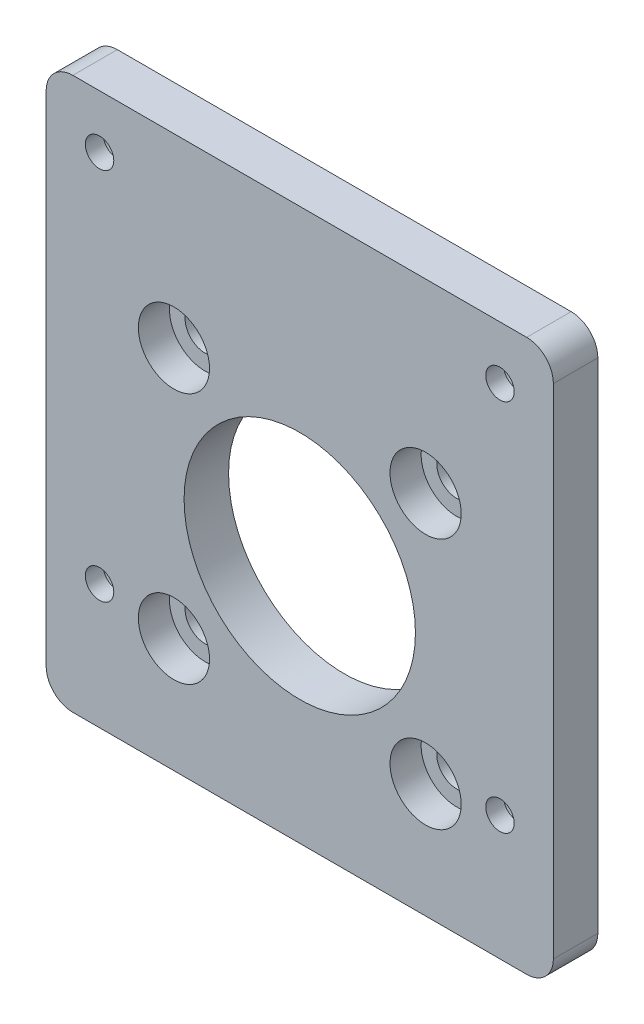
ISO-10303-21;
HEADER;
FILE_DESCRIPTION(('STEP AP214'),'2;1');
FILE_NAME('part.step','',(''),(''),'','','');
FILE_SCHEMA(('AUTOMOTIVE_DESIGN { 1 0 10303 214 1 1 1 1 }'));
ENDSEC;
DATA;
#1=APPLICATION_CONTEXT('core data for automotive mechanical design processes');
#2=APPLICATION_PROTOCOL_DEFINITION('international standard','automotive_design',2000,#1);
#3=PRODUCT_CONTEXT('',#1,'mechanical');
#4=PRODUCT('Part','Part','',(#3));
#5=PRODUCT_RELATED_PRODUCT_CATEGORY('part','',(#4));
#6=PRODUCT_DEFINITION_FORMATION('','',#4);
#7=PRODUCT_DEFINITION_CONTEXT('part definition',#1,'design');
#8=PRODUCT_DEFINITION('design','',#6,#7);
#9=PRODUCT_DEFINITION_SHAPE('','',#8);
#10=(LENGTH_UNIT() NAMED_UNIT(*) SI_UNIT(.MILLI.,.METRE.));
#11=(NAMED_UNIT(*) PLANE_ANGLE_UNIT() SI_UNIT($,.RADIAN.));
#12=(NAMED_UNIT(*) SI_UNIT($,.STERADIAN.) SOLID_ANGLE_UNIT());
#13=UNCERTAINTY_MEASURE_WITH_UNIT(LENGTH_MEASURE(1.E-05),#10,'distance_accuracy_value','');
#14=(GEOMETRIC_REPRESENTATION_CONTEXT(3) GLOBAL_UNCERTAINTY_ASSIGNED_CONTEXT((#13)) GLOBAL_UNIT_ASSIGNED_CONTEXT((#10,
#11,#12)) REPRESENTATION_CONTEXT('',''));
#15=CARTESIAN_POINT('',(0.,0.,0.));
#16=DIRECTION('',(0.,0.,1.));
#17=DIRECTION('',(1.,0.,0.));
#18=AXIS2_PLACEMENT_3D('',#15,#16,#17);
#19=CARTESIAN_POINT('',(-180.668048457713,46.6150386303977,5.));
#20=DIRECTION('',(0.,0.,-1.));
#21=DIRECTION('',(-1.,0.,0.));
#22=AXIS2_PLACEMENT_3D('',#19,#20,#21);
#23=CYLINDRICAL_SURFACE('',#22,2.25000000000001);
#24=CARTESIAN_POINT('',(-180.668048457713,46.6150386303977,0.));
#25=DIRECTION('',(0.,0.,1.));
#26=DIRECTION('',(1.,0.,0.));
#27=AXIS2_PLACEMENT_3D('',#24,#25,#26);
#28=CIRCLE('',#27,2.25000000000001);
#29=CARTESIAN_POINT('',(-178.418048457713,46.6150386303977,0.));
#30=VERTEX_POINT('',#29);
#31=EDGE_CURVE('E161',#30,#30,#28,.T.);
#32=ORIENTED_EDGE('',*,*,#31,.F.);
#33=EDGE_LOOP('',(#32));
#34=FACE_BOUND('',#33,.T.);
#35=CARTESIAN_POINT('',(-180.668048457713,46.6150386303977,1.5));
#36=DIRECTION('',(0.,0.,1.));
#37=DIRECTION('',(1.,0.,0.));
#38=AXIS2_PLACEMENT_3D('',#35,#36,#37);
#39=CIRCLE('',#38,2.25000000000001);
#40=CARTESIAN_POINT('',(-178.418048457713,46.6150386303977,1.5));
#41=VERTEX_POINT('',#40);
#42=EDGE_CURVE('E45',#41,#41,#39,.T.);
#43=ORIENTED_EDGE('',*,*,#42,.T.);
#44=EDGE_LOOP('',(#43));
#45=FACE_BOUND('',#44,.T.);
#46=ADVANCED_FACE('F41',(#34,#45),#23,.F.);
#47=CARTESIAN_POINT('',(-152.383777210251,46.6150386303972,5.));
#48=DIRECTION('',(0.,0.,-1.));
#49=DIRECTION('',(-1.,0.,0.));
#50=AXIS2_PLACEMENT_3D('',#47,#48,#49);
#51=CYLINDRICAL_SURFACE('',#50,2.25000000000001);
#52=CARTESIAN_POINT('',(-152.383777210251,46.6150386303972,0.));
#53=DIRECTION('',(0.,0.,1.));
#54=DIRECTION('',(1.,0.,0.));
#55=AXIS2_PLACEMENT_3D('',#52,#53,#54);
#56=CIRCLE('',#55,2.25000000000001);
#57=CARTESIAN_POINT('',(-150.133777210251,46.6150386303972,0.));
#58=VERTEX_POINT('',#57);
#59=EDGE_CURVE('E158',#58,#58,#56,.T.);
#60=ORIENTED_EDGE('',*,*,#59,.F.);
#61=EDGE_LOOP('',(#60));
#62=FACE_BOUND('',#61,.T.);
#63=CARTESIAN_POINT('',(-152.383777210251,46.6150386303972,1.5));
#64=DIRECTION('',(0.,0.,1.));
#65=DIRECTION('',(1.,0.,0.));
#66=AXIS2_PLACEMENT_3D('',#63,#64,#65);
#67=CIRCLE('',#66,2.25000000000001);
#68=CARTESIAN_POINT('',(-150.133777210251,46.6150386303972,1.5));
#69=VERTEX_POINT('',#68);
#70=EDGE_CURVE('E206',#69,#69,#67,.T.);
#71=ORIENTED_EDGE('',*,*,#70,.T.);
#72=EDGE_LOOP('',(#71));
#73=FACE_BOUND('',#72,.T.);
#74=ADVANCED_FACE('F266',(#62,#73),#51,.F.);
#75=CARTESIAN_POINT('',(-152.383777210252,18.3307673829352,5.));
#76=DIRECTION('',(0.,0.,-1.));
#77=DIRECTION('',(-1.,0.,0.));
#78=AXIS2_PLACEMENT_3D('',#75,#76,#77);
#79=CYLINDRICAL_SURFACE('',#78,2.25000000000001);
#80=CARTESIAN_POINT('',(-152.383777210252,18.3307673829352,0.));
#81=DIRECTION('',(0.,0.,1.));
#82=DIRECTION('',(1.,0.,0.));
#83=AXIS2_PLACEMENT_3D('',#80,#81,#82);
#84=CIRCLE('',#83,2.25000000000001);
#85=CARTESIAN_POINT('',(-150.133777210252,18.3307673829352,0.));
#86=VERTEX_POINT('',#85);
#87=EDGE_CURVE('E154',#86,#86,#84,.T.);
#88=ORIENTED_EDGE('',*,*,#87,.F.);
#89=EDGE_LOOP('',(#88));
#90=FACE_BOUND('',#89,.T.);
#91=CARTESIAN_POINT('',(-152.383777210252,18.3307673829352,1.5));
#92=DIRECTION('',(0.,0.,1.));
#93=DIRECTION('',(1.,0.,0.));
#94=AXIS2_PLACEMENT_3D('',#91,#92,#93);
#95=CIRCLE('',#94,2.25000000000001);
#96=CARTESIAN_POINT('',(-150.133777210252,18.3307673829352,1.5));
#97=VERTEX_POINT('',#96);
#98=EDGE_CURVE('E203',#97,#97,#95,.T.);
#99=ORIENTED_EDGE('',*,*,#98,.T.);
#100=EDGE_LOOP('',(#99));
#101=FACE_BOUND('',#100,.T.);
#102=ADVANCED_FACE('F272',(#90,#101),#79,.F.);
#103=CARTESIAN_POINT('',(-180.668048457714,18.3307673829358,5.));
#104=DIRECTION('',(0.,0.,-1.));
#105=DIRECTION('',(-1.,0.,0.));
#106=AXIS2_PLACEMENT_3D('',#103,#104,#105);
#107=CYLINDRICAL_SURFACE('',#106,2.25000000000001);
#108=CARTESIAN_POINT('',(-180.668048457714,18.3307673829358,0.));
#109=DIRECTION('',(0.,0.,1.));
#110=DIRECTION('',(1.,0.,0.));
#111=AXIS2_PLACEMENT_3D('',#108,#109,#110);
#112=CIRCLE('',#111,2.25000000000001);
#113=CARTESIAN_POINT('',(-178.418048457714,18.3307673829358,0.));
#114=VERTEX_POINT('',#113);
#115=EDGE_CURVE('E151',#114,#114,#112,.T.);
#116=ORIENTED_EDGE('',*,*,#115,.F.);
#117=EDGE_LOOP('',(#116));
#118=FACE_BOUND('',#117,.T.);
#119=CARTESIAN_POINT('',(-180.668048457714,18.3307673829358,1.5));
#120=DIRECTION('',(0.,0.,1.));
#121=DIRECTION('',(1.,0.,0.));
#122=AXIS2_PLACEMENT_3D('',#119,#120,#121);
#123=CIRCLE('',#122,2.25000000000001);
#124=CARTESIAN_POINT('',(-178.418048457714,18.3307673829358,1.5));
#125=VERTEX_POINT('',#124);
#126=EDGE_CURVE('E200',#125,#125,#123,.T.);
#127=ORIENTED_EDGE('',*,*,#126,.T.);
#128=EDGE_LOOP('',(#127));
#129=FACE_BOUND('',#128,.T.);
#130=ADVANCED_FACE('F43',(#118,#129),#107,.F.);
#131=CARTESIAN_POINT('',(0.,67.4729030066661,5.));
#132=DIRECTION('',(0.,1.,0.));
#133=DIRECTION('',(-1.,0.,0.));
#134=AXIS2_PLACEMENT_3D('',#131,#132,#133);
#135=PLANE('',#134);
#136=DIRECTION('',(1.,0.,0.));
#137=VECTOR('',#136,1.);
#138=CARTESIAN_POINT('',(0.,67.4729030066661,0.));
#139=LINE('',#138,#137);
#140=CARTESIAN_POINT('',(-192.025912833983,67.4729030066662,0.));
#141=VERTEX_POINT('',#140);
#142=CARTESIAN_POINT('',(-141.025912833983,67.4729030066661,0.));
#143=VERTEX_POINT('',#142);
#144=EDGE_CURVE('E167',#141,#143,#139,.T.);
#145=ORIENTED_EDGE('',*,*,#144,.F.);
#146=DIRECTION('',(0.,0.,-1.));
#147=VECTOR('',#146,1.);
#148=CARTESIAN_POINT('',(-192.025912833983,67.4729030066662,5.));
#149=LINE('',#148,#147);
#150=CARTESIAN_POINT('',(-192.025912833983,67.4729030066662,5.));
#151=VERTEX_POINT('',#150);
#152=EDGE_CURVE('E12',#151,#141,#149,.T.);
#153=ORIENTED_EDGE('',*,*,#152,.F.);
#154=DIRECTION('',(1.,0.,0.));
#155=VECTOR('',#154,1.);
#156=CARTESIAN_POINT('',(0.,67.4729030066661,5.));
#157=LINE('',#156,#155);
#158=CARTESIAN_POINT('',(-141.025912833983,67.4729030066661,5.));
#159=VERTEX_POINT('',#158);
#160=EDGE_CURVE('E235',#151,#159,#157,.T.);
#161=ORIENTED_EDGE('',*,*,#160,.T.);
#162=DIRECTION('',(0.,0.,-1.));
#163=VECTOR('',#162,1.);
#164=CARTESIAN_POINT('',(-141.025912833983,67.4729030066661,5.));
#165=LINE('',#164,#163);
#166=EDGE_CURVE('E94',#159,#143,#165,.T.);
#167=ORIENTED_EDGE('',*,*,#166,.T.);
#168=EDGE_LOOP('',(#145,#153,#161,#167));
#169=FACE_BOUND('',#168,.T.);
#170=ADVANCED_FACE('F284',(#169),#135,.T.);
#171=CARTESIAN_POINT('',(-192.025912833983,64.4729030066662,5.));
#172=DIRECTION('',(0.,0.,-1.));
#173=DIRECTION('',(-1.,0.,0.));
#174=AXIS2_PLACEMENT_3D('',#171,#172,#173);
#175=CYLINDRICAL_SURFACE('',#174,3.);
#176=CARTESIAN_POINT('',(-192.025912833983,64.4729030066662,0.));
#177=DIRECTION('',(0.,0.,1.));
#178=DIRECTION('',(1.,0.,0.));
#179=AXIS2_PLACEMENT_3D('',#176,#177,#178);
#180=CIRCLE('',#179,3.);
#181=CARTESIAN_POINT('',(-195.025912833983,64.4729030066661,0.));
#182=VERTEX_POINT('',#181);
#183=EDGE_CURVE('E170',#141,#182,#180,.T.);
#184=ORIENTED_EDGE('',*,*,#183,.T.);
#185=DIRECTION('',(0.,0.,-1.));
#186=VECTOR('',#185,1.);
#187=CARTESIAN_POINT('',(-195.025912833983,64.4729030066661,5.));
#188=LINE('',#187,#186);
#189=CARTESIAN_POINT('',(-195.025912833983,64.4729030066661,5.));
#190=VERTEX_POINT('',#189);
#191=EDGE_CURVE('E51',#190,#182,#188,.T.);
#192=ORIENTED_EDGE('',*,*,#191,.F.);
#193=CARTESIAN_POINT('',(-192.025912833983,64.4729030066662,5.));
#194=DIRECTION('',(0.,0.,1.));
#195=DIRECTION('',(1.,0.,0.));
#196=AXIS2_PLACEMENT_3D('',#193,#194,#195);
#197=CIRCLE('',#196,3.);
#198=EDGE_CURVE('E237',#151,#190,#197,.T.);
#199=ORIENTED_EDGE('',*,*,#198,.F.);
#200=ORIENTED_EDGE('',*,*,#152,.T.);
#201=EDGE_LOOP('',(#184,#192,#199,#200));
#202=FACE_BOUND('',#201,.T.);
#203=ADVANCED_FACE('F655',(#202),#175,.T.);
#204=CARTESIAN_POINT('',(-195.025912833983,0.,5.));
#205=DIRECTION('',(1.,0.,0.));
#206=DIRECTION('',(0.,0.,-1.));
#207=AXIS2_PLACEMENT_3D('',#204,#205,#206);
#208=PLANE('',#207);
#209=DIRECTION('',(0.,-1.,0.));
#210=VECTOR('',#209,1.);
#211=CARTESIAN_POINT('',(-195.025912833983,0.,0.));
#212=LINE('',#211,#210);
#213=CARTESIAN_POINT('',(-195.025912833983,8.47290300666616,0.));
#214=VERTEX_POINT('',#213);
#215=EDGE_CURVE('E173',#182,#214,#212,.T.);
#216=ORIENTED_EDGE('',*,*,#215,.T.);
#217=DIRECTION('',(0.,0.,-1.));
#218=VECTOR('',#217,1.);
#219=CARTESIAN_POINT('',(-195.025912833983,8.47290300666616,5.));
#220=LINE('',#219,#218);
#221=CARTESIAN_POINT('',(-195.025912833983,8.47290300666616,5.));
#222=VERTEX_POINT('',#221);
#223=EDGE_CURVE('E193',#222,#214,#220,.T.);
#224=ORIENTED_EDGE('',*,*,#223,.F.);
#225=DIRECTION('',(0.,-1.,0.));
#226=VECTOR('',#225,1.);
#227=CARTESIAN_POINT('',(-195.025912833983,0.,5.));
#228=LINE('',#227,#226);
#229=EDGE_CURVE('E240',#190,#222,#228,.T.);
#230=ORIENTED_EDGE('',*,*,#229,.F.);
#231=ORIENTED_EDGE('',*,*,#191,.T.);
#232=EDGE_LOOP('',(#216,#224,#230,#231));
#233=FACE_BOUND('',#232,.T.);
#234=ADVANCED_FACE('F250',(#233),#208,.F.);
#235=CARTESIAN_POINT('',(-192.025912833983,8.47290300666614,5.));
#236=DIRECTION('',(0.,0.,-1.));
#237=DIRECTION('',(-1.,0.,0.));
#238=AXIS2_PLACEMENT_3D('',#235,#236,#237);
#239=CYLINDRICAL_SURFACE('',#238,3.);
#240=CARTESIAN_POINT('',(-192.025912833983,8.47290300666614,0.));
#241=DIRECTION('',(0.,0.,1.));
#242=DIRECTION('',(1.,0.,0.));
#243=AXIS2_PLACEMENT_3D('',#240,#241,#242);
#244=CIRCLE('',#243,3.);
#245=CARTESIAN_POINT('',(-192.025912833983,5.47290300666614,0.));
#246=VERTEX_POINT('',#245);
#247=EDGE_CURVE('E176',#246,#214,#244,.F.);
#248=ORIENTED_EDGE('',*,*,#247,.F.);
#249=DIRECTION('',(0.,0.,-1.));
#250=VECTOR('',#249,1.);
#251=CARTESIAN_POINT('',(-192.025912833983,5.47290300666614,5.));
#252=LINE('',#251,#250);
#253=CARTESIAN_POINT('',(-192.025912833983,5.47290300666614,5.));
#254=VERTEX_POINT('',#253);
#255=EDGE_CURVE('E191',#254,#246,#252,.T.);
#256=ORIENTED_EDGE('',*,*,#255,.F.);
#257=CARTESIAN_POINT('',(-192.025912833983,8.47290300666614,5.));
#258=DIRECTION('',(0.,0.,1.));
#259=DIRECTION('',(1.,0.,0.));
#260=AXIS2_PLACEMENT_3D('',#257,#258,#259);
#261=CIRCLE('',#260,3.);
#262=EDGE_CURVE('E242',#254,#222,#261,.F.);
#263=ORIENTED_EDGE('',*,*,#262,.T.);
#264=ORIENTED_EDGE('',*,*,#223,.T.);
#265=EDGE_LOOP('',(#248,#256,#263,#264));
#266=FACE_BOUND('',#265,.T.);
#267=ADVANCED_FACE('F246',(#266),#239,.T.);
#268=CARTESIAN_POINT('',(0.,5.47290300666614,5.));
#269=DIRECTION('',(0.,1.,0.));
#270=DIRECTION('',(-1.,0.,0.));
#271=AXIS2_PLACEMENT_3D('',#268,#269,#270);
#272=PLANE('',#271);
#273=DIRECTION('',(1.,0.,0.));
#274=VECTOR('',#273,1.);
#275=CARTESIAN_POINT('',(0.,5.47290300666614,0.));
#276=LINE('',#275,#274);
#277=CARTESIAN_POINT('',(-141.025912833983,5.47290300666614,0.));
#278=VERTEX_POINT('',#277);
#279=EDGE_CURVE('E179',#246,#278,#276,.T.);
#280=ORIENTED_EDGE('',*,*,#279,.T.);
#281=DIRECTION('',(0.,0.,-1.));
#282=VECTOR('',#281,1.);
#283=CARTESIAN_POINT('',(-141.025912833983,5.47290300666614,5.));
#284=LINE('',#283,#282);
#285=CARTESIAN_POINT('',(-141.025912833983,5.47290300666614,5.));
#286=VERTEX_POINT('',#285);
#287=EDGE_CURVE('E132',#286,#278,#284,.T.);
#288=ORIENTED_EDGE('',*,*,#287,.F.);
#289=DIRECTION('',(1.,0.,0.));
#290=VECTOR('',#289,1.);
#291=CARTESIAN_POINT('',(0.,5.47290300666614,5.));
#292=LINE('',#291,#290);
#293=EDGE_CURVE('E120',#254,#286,#292,.T.);
#294=ORIENTED_EDGE('',*,*,#293,.F.);
#295=ORIENTED_EDGE('',*,*,#255,.T.);
#296=EDGE_LOOP('',(#280,#288,#294,#295));
#297=FACE_BOUND('',#296,.T.);
#298=ADVANCED_FACE('F256',(#297),#272,.F.);
#299=CARTESIAN_POINT('',(-141.025912833983,8.47290300666614,5.));
#300=DIRECTION('',(0.,0.,-1.));
#301=DIRECTION('',(-1.,0.,0.));
#302=AXIS2_PLACEMENT_3D('',#299,#300,#301);
#303=CYLINDRICAL_SURFACE('',#302,3.);
#304=CARTESIAN_POINT('',(-141.025912833983,8.47290300666614,0.));
#305=DIRECTION('',(0.,0.,1.));
#306=DIRECTION('',(1.,0.,0.));
#307=AXIS2_PLACEMENT_3D('',#304,#305,#306);
#308=CIRCLE('',#307,3.);
#309=CARTESIAN_POINT('',(-138.025912833983,8.47290300666616,0.));
#310=VERTEX_POINT('',#309);
#311=EDGE_CURVE('E128',#278,#310,#308,.T.);
#312=ORIENTED_EDGE('',*,*,#311,.T.);
#313=DIRECTION('',(0.,0.,-1.));
#314=VECTOR('',#313,1.);
#315=CARTESIAN_POINT('',(-138.025912833983,8.47290300666616,5.));
#316=LINE('',#315,#314);
#317=CARTESIAN_POINT('',(-138.025912833983,8.47290300666616,5.));
#318=VERTEX_POINT('',#317);
#319=EDGE_CURVE('E126',#318,#310,#316,.T.);
#320=ORIENTED_EDGE('',*,*,#319,.F.);
#321=CARTESIAN_POINT('',(-141.025912833983,8.47290300666614,5.));
#322=DIRECTION('',(0.,0.,1.));
#323=DIRECTION('',(1.,0.,0.));
#324=AXIS2_PLACEMENT_3D('',#321,#322,#323);
#325=CIRCLE('',#324,3.);
#326=EDGE_CURVE('E112',#286,#318,#325,.T.);
#327=ORIENTED_EDGE('',*,*,#326,.F.);
#328=ORIENTED_EDGE('',*,*,#287,.T.);
#329=EDGE_LOOP('',(#312,#320,#327,#328));
#330=FACE_BOUND('',#329,.T.);
#331=ADVANCED_FACE('F127',(#330),#303,.T.);
#332=CARTESIAN_POINT('',(-138.025912833983,0.,5.));
#333=DIRECTION('',(1.,0.,0.));
#334=DIRECTION('',(0.,0.,-1.));
#335=AXIS2_PLACEMENT_3D('',#332,#333,#334);
#336=PLANE('',#335);
#337=DIRECTION('',(0.,-1.,0.));
#338=VECTOR('',#337,1.);
#339=CARTESIAN_POINT('',(-138.025912833983,0.,0.));
#340=LINE('',#339,#338);
#341=CARTESIAN_POINT('',(-138.025912833983,64.4729030066661,0.));
#342=VERTEX_POINT('',#341);
#343=EDGE_CURVE('E183',#342,#310,#340,.T.);
#344=ORIENTED_EDGE('',*,*,#343,.F.);
#345=DIRECTION('',(0.,0.,-1.));
#346=VECTOR('',#345,1.);
#347=CARTESIAN_POINT('',(-138.025912833983,64.4729030066661,5.));
#348=LINE('',#347,#346);
#349=CARTESIAN_POINT('',(-138.025912833983,64.4729030066661,5.));
#350=VERTEX_POINT('',#349);
#351=EDGE_CURVE('E87',#350,#342,#348,.T.);
#352=ORIENTED_EDGE('',*,*,#351,.F.);
#353=DIRECTION('',(0.,-1.,0.));
#354=VECTOR('',#353,1.);
#355=CARTESIAN_POINT('',(-138.025912833983,0.,5.));
#356=LINE('',#355,#354);
#357=EDGE_CURVE('E117',#350,#318,#356,.T.);
#358=ORIENTED_EDGE('',*,*,#357,.T.);
#359=ORIENTED_EDGE('',*,*,#319,.T.);
#360=EDGE_LOOP('',(#344,#352,#358,#359));
#361=FACE_BOUND('',#360,.T.);
#362=ADVANCED_FACE('F134',(#361),#336,.T.);
#363=CARTESIAN_POINT('',(-144.025912833983,61.4729030066658,5.));
#364=DIRECTION('',(0.,0.,-1.));
#365=DIRECTION('',(-1.,0.,0.));
#366=AXIS2_PLACEMENT_3D('',#363,#364,#365);
#367=CYLINDRICAL_SURFACE('',#366,1.59999999999999);
#368=CARTESIAN_POINT('',(-144.025912833983,61.4729030066658,3.));
#369=DIRECTION('',(0.,0.,1.));
#370=DIRECTION('',(1.,0.,0.));
#371=AXIS2_PLACEMENT_3D('',#368,#369,#370);
#372=CIRCLE('',#371,1.59999999999999);
#373=CARTESIAN_POINT('',(-142.425912833983,61.4729030066658,3.));
#374=VERTEX_POINT('',#373);
#375=EDGE_CURVE('E323',#374,#374,#372,.F.);
#376=ORIENTED_EDGE('',*,*,#375,.T.);
#377=EDGE_LOOP('',(#376));
#378=FACE_BOUND('',#377,.T.);
#379=CARTESIAN_POINT('',(-144.025912833983,61.4729030066658,5.));
#380=DIRECTION('',(0.,0.,1.));
#381=DIRECTION('',(1.,0.,0.));
#382=AXIS2_PLACEMENT_3D('',#379,#380,#381);
#383=CIRCLE('',#382,1.59999999999999);
#384=CARTESIAN_POINT('',(-142.425912833983,61.4729030066658,5.));
#385=VERTEX_POINT('',#384);
#386=EDGE_CURVE('E145',#385,#385,#383,.F.);
#387=ORIENTED_EDGE('',*,*,#386,.F.);
#388=EDGE_LOOP('',(#387));
#389=FACE_BOUND('',#388,.T.);
#390=ADVANCED_FACE('F368',(#378,#389),#367,.F.);
#391=CARTESIAN_POINT('',(-189.025912833982,19.4729030066665,5.));
#392=DIRECTION('',(0.,0.,-1.));
#393=DIRECTION('',(-1.,0.,0.));
#394=AXIS2_PLACEMENT_3D('',#391,#392,#393);
#395=CYLINDRICAL_SURFACE('',#394,1.59999999999999);
#396=CARTESIAN_POINT('',(-189.025912833982,19.4729030066665,3.));
#397=DIRECTION('',(0.,0.,1.));
#398=DIRECTION('',(1.,0.,0.));
#399=AXIS2_PLACEMENT_3D('',#396,#397,#398);
#400=CIRCLE('',#399,1.59999999999999);
#401=CARTESIAN_POINT('',(-187.425912833982,19.4729030066665,3.));
#402=VERTEX_POINT('',#401);
#403=EDGE_CURVE('E155',#402,#402,#400,.F.);
#404=ORIENTED_EDGE('',*,*,#403,.T.);
#405=EDGE_LOOP('',(#404));
#406=FACE_BOUND('',#405,.T.);
#407=CARTESIAN_POINT('',(-189.025912833982,19.4729030066665,5.));
#408=DIRECTION('',(0.,0.,1.));
#409=DIRECTION('',(1.,0.,0.));
#410=AXIS2_PLACEMENT_3D('',#407,#408,#409);
#411=CIRCLE('',#410,1.59999999999999);
#412=CARTESIAN_POINT('',(-187.425912833982,19.4729030066665,5.));
#413=VERTEX_POINT('',#412);
#414=EDGE_CURVE('E142',#413,#413,#411,.F.);
#415=ORIENTED_EDGE('',*,*,#414,.F.);
#416=EDGE_LOOP('',(#415));
#417=FACE_BOUND('',#416,.T.);
#418=ADVANCED_FACE('F344',(#406,#417),#395,.F.);
#419=CARTESIAN_POINT('',(-144.025912833983,19.4729030066665,5.));
#420=DIRECTION('',(0.,0.,-1.));
#421=DIRECTION('',(-1.,0.,0.));
#422=AXIS2_PLACEMENT_3D('',#419,#420,#421);
#423=CYLINDRICAL_SURFACE('',#422,1.59999999999999);
#424=CARTESIAN_POINT('',(-144.025912833983,19.4729030066665,3.));
#425=DIRECTION('',(0.,0.,1.));
#426=DIRECTION('',(1.,0.,0.));
#427=AXIS2_PLACEMENT_3D('',#424,#425,#426);
#428=CIRCLE('',#427,1.59999999999999);
#429=CARTESIAN_POINT('',(-142.425912833983,19.4729030066665,3.));
#430=VERTEX_POINT('',#429);
#431=EDGE_CURVE('E332',#430,#430,#428,.T.);
#432=ORIENTED_EDGE('',*,*,#431,.F.);
#433=EDGE_LOOP('',(#432));
#434=FACE_BOUND('',#433,.T.);
#435=CARTESIAN_POINT('',(-144.025912833983,19.4729030066665,5.));
#436=DIRECTION('',(0.,0.,1.));
#437=DIRECTION('',(1.,0.,0.));
#438=AXIS2_PLACEMENT_3D('',#435,#436,#437);
#439=CIRCLE('',#438,1.59999999999999);
#440=CARTESIAN_POINT('',(-142.425912833983,19.4729030066665,5.));
#441=VERTEX_POINT('',#440);
#442=EDGE_CURVE('E136',#441,#441,#439,.T.);
#443=ORIENTED_EDGE('',*,*,#442,.T.);
#444=EDGE_LOOP('',(#443));
#445=FACE_BOUND('',#444,.T.);
#446=ADVANCED_FACE('F340',(#434,#445),#423,.F.);
#447=CARTESIAN_POINT('',(-141.025912833983,64.4729030066661,5.));
#448=DIRECTION('',(0.,0.,-1.));
#449=DIRECTION('',(-1.,0.,0.));
#450=AXIS2_PLACEMENT_3D('',#447,#448,#449);
#451=CYLINDRICAL_SURFACE('',#450,3.);
#452=CARTESIAN_POINT('',(-141.025912833983,64.4729030066661,0.));
#453=DIRECTION('',(0.,0.,1.));
#454=DIRECTION('',(1.,0.,0.));
#455=AXIS2_PLACEMENT_3D('',#452,#453,#454);
#456=CIRCLE('',#455,3.);
#457=EDGE_CURVE('E185',#342,#143,#456,.T.);
#458=ORIENTED_EDGE('',*,*,#457,.T.);
#459=ORIENTED_EDGE('',*,*,#166,.F.);
#460=CARTESIAN_POINT('',(-141.025912833983,64.4729030066661,5.));
#461=DIRECTION('',(0.,0.,1.));
#462=DIRECTION('',(1.,0.,0.));
#463=AXIS2_PLACEMENT_3D('',#460,#461,#462);
#464=CIRCLE('',#463,3.);
#465=EDGE_CURVE('E60',#350,#159,#464,.T.);
#466=ORIENTED_EDGE('',*,*,#465,.F.);
#467=ORIENTED_EDGE('',*,*,#351,.T.);
#468=EDGE_LOOP('',(#458,#459,#466,#467));
#469=FACE_BOUND('',#468,.T.);
#470=ADVANCED_FACE('F343',(#469),#451,.T.);
#471=CARTESIAN_POINT('',(-166.525912833983,32.4729030066665,5.));
#472=DIRECTION('',(0.,0.,-1.));
#473=DIRECTION('',(-1.,0.,0.));
#474=AXIS2_PLACEMENT_3D('',#471,#472,#473);
#475=CYLINDRICAL_SURFACE('',#474,13.);
#476=CARTESIAN_POINT('',(-166.525912833983,32.4729030066665,5.));
#477=DIRECTION('',(0.,0.,1.));
#478=DIRECTION('',(1.,0.,0.));
#479=AXIS2_PLACEMENT_3D('',#476,#477,#478);
#480=CIRCLE('',#479,13.);
#481=CARTESIAN_POINT('',(-153.525912833983,32.4729030066665,5.));
#482=VERTEX_POINT('',#481);
#483=EDGE_CURVE('E187',#482,#482,#480,.T.);
#484=ORIENTED_EDGE('',*,*,#483,.T.);
#485=EDGE_LOOP('',(#484));
#486=FACE_BOUND('',#485,.T.);
#487=CARTESIAN_POINT('',(-166.525912833983,32.4729030066665,0.));
#488=DIRECTION('',(0.,0.,1.));
#489=DIRECTION('',(1.,0.,0.));
#490=AXIS2_PLACEMENT_3D('',#487,#488,#489);
#491=CIRCLE('',#490,13.);
#492=CARTESIAN_POINT('',(-153.525912833983,32.4729030066665,0.));
#493=VERTEX_POINT('',#492);
#494=EDGE_CURVE('E164',#493,#493,#491,.T.);
#495=ORIENTED_EDGE('',*,*,#494,.F.);
#496=EDGE_LOOP('',(#495));
#497=FACE_BOUND('',#496,.T.);
#498=ADVANCED_FACE('F277',(#486,#497),#475,.F.);
#499=CARTESIAN_POINT('',(-189.025912833982,61.4729030066658,5.));
#500=DIRECTION('',(0.,0.,-1.));
#501=DIRECTION('',(-1.,0.,0.));
#502=AXIS2_PLACEMENT_3D('',#499,#500,#501);
#503=CYLINDRICAL_SURFACE('',#502,1.59999999999999);
#504=CARTESIAN_POINT('',(-189.025912833982,61.4729030066658,3.));
#505=DIRECTION('',(0.,0.,1.));
#506=DIRECTION('',(1.,0.,0.));
#507=AXIS2_PLACEMENT_3D('',#504,#505,#506);
#508=CIRCLE('',#507,1.59999999999999);
#509=CARTESIAN_POINT('',(-187.425912833982,61.4729030066658,3.));
#510=VERTEX_POINT('',#509);
#511=EDGE_CURVE('E224',#510,#510,#508,.T.);
#512=ORIENTED_EDGE('',*,*,#511,.F.);
#513=EDGE_LOOP('',(#512));
#514=FACE_BOUND('',#513,.T.);
#515=CARTESIAN_POINT('',(-189.025912833982,61.4729030066658,5.));
#516=DIRECTION('',(0.,0.,1.));
#517=DIRECTION('',(1.,0.,0.));
#518=AXIS2_PLACEMENT_3D('',#515,#516,#517);
#519=CIRCLE('',#518,1.59999999999999);
#520=CARTESIAN_POINT('',(-187.425912833982,61.4729030066658,5.));
#521=VERTEX_POINT('',#520);
#522=EDGE_CURVE('E148',#521,#521,#519,.T.);
#523=ORIENTED_EDGE('',*,*,#522,.T.);
#524=EDGE_LOOP('',(#523));
#525=FACE_BOUND('',#524,.T.);
#526=ADVANCED_FACE('F349',(#514,#525),#503,.F.);
#527=CARTESIAN_POINT('',(0.,0.,5.));
#528=DIRECTION('',(0.,0.,1.));
#529=DIRECTION('',(1.,0.,0.));
#530=AXIS2_PLACEMENT_3D('',#527,#528,#529);
#531=PLANE('',#530);
#532=CARTESIAN_POINT('',(-180.668048457714,18.3307673829358,5.));
#533=DIRECTION('',(0.,0.,1.));
#534=DIRECTION('',(1.,0.,0.));
#535=AXIS2_PLACEMENT_3D('',#532,#533,#534);
#536=CIRCLE('',#535,3.99999999999999);
#537=CARTESIAN_POINT('',(-176.668048457714,18.3307673829358,5.));
#538=VERTEX_POINT('',#537);
#539=EDGE_CURVE('E313',#538,#538,#536,.T.);
#540=ORIENTED_EDGE('',*,*,#539,.F.);
#541=EDGE_LOOP('',(#540));
#542=FACE_BOUND('',#541,.T.);
#543=CARTESIAN_POINT('',(-152.383777210252,18.3307673829352,5.));
#544=DIRECTION('',(0.,0.,1.));
#545=DIRECTION('',(1.,0.,0.));
#546=AXIS2_PLACEMENT_3D('',#543,#544,#545);
#547=CIRCLE('',#546,3.99999999999999);
#548=CARTESIAN_POINT('',(-148.383777210252,18.3307673829352,5.));
#549=VERTEX_POINT('',#548);
#550=EDGE_CURVE('E301',#549,#549,#547,.T.);
#551=ORIENTED_EDGE('',*,*,#550,.F.);
#552=EDGE_LOOP('',(#551));
#553=FACE_BOUND('',#552,.T.);
#554=CARTESIAN_POINT('',(-152.383777210251,46.6150386303972,5.));
#555=DIRECTION('',(0.,0.,1.));
#556=DIRECTION('',(1.,0.,0.));
#557=AXIS2_PLACEMENT_3D('',#554,#555,#556);
#558=CIRCLE('',#557,3.99999999999999);
#559=CARTESIAN_POINT('',(-148.383777210251,46.6150386303972,5.));
#560=VERTEX_POINT('',#559);
#561=EDGE_CURVE('E300',#560,#560,#558,.T.);
#562=ORIENTED_EDGE('',*,*,#561,.F.);
#563=EDGE_LOOP('',(#562));
#564=FACE_BOUND('',#563,.T.);
#565=CARTESIAN_POINT('',(-180.668048457713,46.6150386303977,5.));
#566=DIRECTION('',(0.,0.,1.));
#567=DIRECTION('',(1.,0.,0.));
#568=AXIS2_PLACEMENT_3D('',#565,#566,#567);
#569=CIRCLE('',#568,3.99999999999999);
#570=CARTESIAN_POINT('',(-176.668048457713,46.6150386303977,5.));
#571=VERTEX_POINT('',#570);
#572=EDGE_CURVE('E318',#571,#571,#569,.T.);
#573=ORIENTED_EDGE('',*,*,#572,.F.);
#574=EDGE_LOOP('',(#573));
#575=FACE_BOUND('',#574,.T.);
#576=ORIENTED_EDGE('',*,*,#483,.F.);
#577=EDGE_LOOP('',(#576));
#578=FACE_BOUND('',#577,.T.);
#579=ORIENTED_EDGE('',*,*,#160,.F.);
#580=ORIENTED_EDGE('',*,*,#198,.T.);
#581=ORIENTED_EDGE('',*,*,#229,.T.);
#582=ORIENTED_EDGE('',*,*,#262,.F.);
#583=ORIENTED_EDGE('',*,*,#293,.T.);
#584=ORIENTED_EDGE('',*,*,#326,.T.);
#585=ORIENTED_EDGE('',*,*,#357,.F.);
#586=ORIENTED_EDGE('',*,*,#465,.T.);
#587=EDGE_LOOP('',(#579,#580,#581,#582,#583,#584,#585,#586));
#588=FACE_BOUND('',#587,.T.);
#589=ORIENTED_EDGE('',*,*,#442,.F.);
#590=EDGE_LOOP('',(#589));
#591=FACE_BOUND('',#590,.T.);
#592=ORIENTED_EDGE('',*,*,#414,.T.);
#593=EDGE_LOOP('',(#592));
#594=FACE_BOUND('',#593,.T.);
#595=ORIENTED_EDGE('',*,*,#386,.T.);
#596=EDGE_LOOP('',(#595));
#597=FACE_BOUND('',#596,.T.);
#598=ORIENTED_EDGE('',*,*,#522,.F.);
#599=EDGE_LOOP('',(#598));
#600=FACE_BOUND('',#599,.T.);
#601=ADVANCED_FACE('F114',(#542,#553,#564,#575,#578,#588,#591,#594,#597,#600),#531,.T.);
#602=CARTESIAN_POINT('',(0.,0.,0.));
#603=DIRECTION('',(0.,0.,1.));
#604=DIRECTION('',(1.,0.,0.));
#605=AXIS2_PLACEMENT_3D('',#602,#603,#604);
#606=PLANE('',#605);
#607=CARTESIAN_POINT('',(-189.025912833982,19.4729030066665,0.));
#608=DIRECTION('',(0.,0.,1.));
#609=DIRECTION('',(1.,0.,0.));
#610=AXIS2_PLACEMENT_3D('',#607,#608,#609);
#611=CIRCLE('',#610,2.99999999999999);
#612=CARTESIAN_POINT('',(-186.025912833982,19.4729030066665,0.));
#613=VERTEX_POINT('',#612);
#614=EDGE_CURVE('E215',#613,#613,#611,.T.);
#615=ORIENTED_EDGE('',*,*,#614,.T.);
#616=EDGE_LOOP('',(#615));
#617=FACE_BOUND('',#616,.T.);
#618=CARTESIAN_POINT('',(-144.025912833983,19.4729030066665,0.));
#619=DIRECTION('',(0.,0.,1.));
#620=DIRECTION('',(1.,0.,0.));
#621=AXIS2_PLACEMENT_3D('',#618,#619,#620);
#622=CIRCLE('',#621,2.99999999999999);
#623=CARTESIAN_POINT('',(-141.025912833983,19.4729030066665,0.));
#624=VERTEX_POINT('',#623);
#625=EDGE_CURVE('E327',#624,#624,#622,.T.);
#626=ORIENTED_EDGE('',*,*,#625,.T.);
#627=EDGE_LOOP('',(#626));
#628=FACE_BOUND('',#627,.T.);
#629=CARTESIAN_POINT('',(-144.025912833983,61.4729030066658,0.));
#630=DIRECTION('',(0.,0.,1.));
#631=DIRECTION('',(1.,0.,0.));
#632=AXIS2_PLACEMENT_3D('',#629,#630,#631);
#633=CIRCLE('',#632,3.0000000000008);
#634=CARTESIAN_POINT('',(-141.025912833982,61.4729030066658,0.));
#635=VERTEX_POINT('',#634);
#636=EDGE_CURVE('E232',#635,#635,#633,.T.);
#637=ORIENTED_EDGE('',*,*,#636,.T.);
#638=EDGE_LOOP('',(#637));
#639=FACE_BOUND('',#638,.T.);
#640=CARTESIAN_POINT('',(-189.025912833982,61.4729030066658,0.));
#641=DIRECTION('',(0.,0.,1.));
#642=DIRECTION('',(1.,0.,0.));
#643=AXIS2_PLACEMENT_3D('',#640,#641,#642);
#644=CIRCLE('',#643,3.00000000000076);
#645=CARTESIAN_POINT('',(-186.025912833981,61.4729030066658,0.));
#646=VERTEX_POINT('',#645);
#647=EDGE_CURVE('E227',#646,#646,#644,.T.);
#648=ORIENTED_EDGE('',*,*,#647,.T.);
#649=EDGE_LOOP('',(#648));
#650=FACE_BOUND('',#649,.T.);
#651=ORIENTED_EDGE('',*,*,#115,.T.);
#652=EDGE_LOOP('',(#651));
#653=FACE_BOUND('',#652,.T.);
#654=ORIENTED_EDGE('',*,*,#87,.T.);
#655=EDGE_LOOP('',(#654));
#656=FACE_BOUND('',#655,.T.);
#657=ORIENTED_EDGE('',*,*,#59,.T.);
#658=EDGE_LOOP('',(#657));
#659=FACE_BOUND('',#658,.T.);
#660=ORIENTED_EDGE('',*,*,#31,.T.);
#661=EDGE_LOOP('',(#660));
#662=FACE_BOUND('',#661,.T.);
#663=ORIENTED_EDGE('',*,*,#494,.T.);
#664=EDGE_LOOP('',(#663));
#665=FACE_BOUND('',#664,.T.);
#666=ORIENTED_EDGE('',*,*,#144,.T.);
#667=ORIENTED_EDGE('',*,*,#457,.F.);
#668=ORIENTED_EDGE('',*,*,#343,.T.);
#669=ORIENTED_EDGE('',*,*,#311,.F.);
#670=ORIENTED_EDGE('',*,*,#279,.F.);
#671=ORIENTED_EDGE('',*,*,#247,.T.);
#672=ORIENTED_EDGE('',*,*,#215,.F.);
#673=ORIENTED_EDGE('',*,*,#183,.F.);
#674=EDGE_LOOP('',(#666,#667,#668,#669,#670,#671,#672,#673));
#675=FACE_BOUND('',#674,.T.);
#676=ADVANCED_FACE('F254',(#617,#628,#639,#650,#653,#656,#659,#662,#665,#675),#606,.F.);
#677=CARTESIAN_POINT('',(-189.025912833982,61.4729030066658,3.));
#678=DIRECTION('',(0.,0.,-1.));
#679=DIRECTION('',(-1.,0.,0.));
#680=AXIS2_PLACEMENT_3D('',#677,#678,#679);
#681=CYLINDRICAL_SURFACE('',#680,3.00000000000076);
#682=CARTESIAN_POINT('',(-189.025912833982,61.4729030066658,3.));
#683=DIRECTION('',(0.,0.,1.));
#684=DIRECTION('',(1.,0.,0.));
#685=AXIS2_PLACEMENT_3D('',#682,#683,#684);
#686=CIRCLE('',#685,3.00000000000076);
#687=CARTESIAN_POINT('',(-186.025912833981,61.4729030066658,3.));
#688=VERTEX_POINT('',#687);
#689=EDGE_CURVE('E199',#688,#688,#686,.T.);
#690=ORIENTED_EDGE('',*,*,#689,.T.);
#691=EDGE_LOOP('',(#690));
#692=FACE_BOUND('',#691,.T.);
#693=ORIENTED_EDGE('',*,*,#647,.F.);
#694=EDGE_LOOP('',(#693));
#695=FACE_BOUND('',#694,.T.);
#696=ADVANCED_FACE('F437',(#692,#695),#681,.F.);
#697=CARTESIAN_POINT('',(0.,0.,3.));
#698=DIRECTION('',(0.,0.,1.));
#699=DIRECTION('',(1.,0.,0.));
#700=AXIS2_PLACEMENT_3D('',#697,#698,#699);
#701=PLANE('',#700);
#702=ORIENTED_EDGE('',*,*,#511,.T.);
#703=EDGE_LOOP('',(#702));
#704=FACE_BOUND('',#703,.T.);
#705=ORIENTED_EDGE('',*,*,#689,.F.);
#706=EDGE_LOOP('',(#705));
#707=FACE_BOUND('',#706,.T.);
#708=ADVANCED_FACE('F457',(#704,#707),#701,.F.);
#709=CARTESIAN_POINT('',(-144.025912833983,61.4729030066658,3.));
#710=DIRECTION('',(0.,0.,-1.));
#711=DIRECTION('',(-1.,0.,0.));
#712=AXIS2_PLACEMENT_3D('',#709,#710,#711);
#713=CYLINDRICAL_SURFACE('',#712,3.0000000000008);
#714=CARTESIAN_POINT('',(-144.025912833983,61.4729030066658,3.));
#715=DIRECTION('',(0.,0.,1.));
#716=DIRECTION('',(1.,0.,0.));
#717=AXIS2_PLACEMENT_3D('',#714,#715,#716);
#718=CIRCLE('',#717,3.0000000000008);
#719=CARTESIAN_POINT('',(-141.025912833982,61.4729030066658,3.));
#720=VERTEX_POINT('',#719);
#721=EDGE_CURVE('E324',#720,#720,#718,.T.);
#722=ORIENTED_EDGE('',*,*,#721,.T.);
#723=EDGE_LOOP('',(#722));
#724=FACE_BOUND('',#723,.T.);
#725=ORIENTED_EDGE('',*,*,#636,.F.);
#726=EDGE_LOOP('',(#725));
#727=FACE_BOUND('',#726,.T.);
#728=ADVANCED_FACE('F469',(#724,#727),#713,.F.);
#729=CARTESIAN_POINT('',(0.,0.,3.));
#730=DIRECTION('',(0.,0.,1.));
#731=DIRECTION('',(1.,0.,0.));
#732=AXIS2_PLACEMENT_3D('',#729,#730,#731);
#733=PLANE('',#732);
#734=ORIENTED_EDGE('',*,*,#375,.F.);
#735=EDGE_LOOP('',(#734));
#736=FACE_BOUND('',#735,.T.);
#737=ORIENTED_EDGE('',*,*,#721,.F.);
#738=EDGE_LOOP('',(#737));
#739=FACE_BOUND('',#738,.T.);
#740=ADVANCED_FACE('F478',(#736,#739),#733,.F.);
#741=CARTESIAN_POINT('',(-144.025912833983,19.4729030066665,3.));
#742=DIRECTION('',(0.,0.,-1.));
#743=DIRECTION('',(-1.,0.,0.));
#744=AXIS2_PLACEMENT_3D('',#741,#742,#743);
#745=CYLINDRICAL_SURFACE('',#744,2.99999999999999);
#746=CARTESIAN_POINT('',(-144.025912833983,19.4729030066665,3.));
#747=DIRECTION('',(0.,0.,1.));
#748=DIRECTION('',(1.,0.,0.));
#749=AXIS2_PLACEMENT_3D('',#746,#747,#748);
#750=CIRCLE('',#749,2.99999999999999);
#751=CARTESIAN_POINT('',(-141.025912833983,19.4729030066665,3.));
#752=VERTEX_POINT('',#751);
#753=EDGE_CURVE('E220',#752,#752,#750,.T.);
#754=ORIENTED_EDGE('',*,*,#753,.T.);
#755=EDGE_LOOP('',(#754));
#756=FACE_BOUND('',#755,.T.);
#757=ORIENTED_EDGE('',*,*,#625,.F.);
#758=EDGE_LOOP('',(#757));
#759=FACE_BOUND('',#758,.T.);
#760=ADVANCED_FACE('F490',(#756,#759),#745,.F.);
#761=CARTESIAN_POINT('',(0.,0.,3.));
#762=DIRECTION('',(0.,0.,1.));
#763=DIRECTION('',(1.,0.,0.));
#764=AXIS2_PLACEMENT_3D('',#761,#762,#763);
#765=PLANE('',#764);
#766=ORIENTED_EDGE('',*,*,#431,.T.);
#767=EDGE_LOOP('',(#766));
#768=FACE_BOUND('',#767,.T.);
#769=ORIENTED_EDGE('',*,*,#753,.F.);
#770=EDGE_LOOP('',(#769));
#771=FACE_BOUND('',#770,.T.);
#772=ADVANCED_FACE('F337',(#768,#771),#765,.F.);
#773=CARTESIAN_POINT('',(0.,0.,3.));
#774=DIRECTION('',(0.,0.,1.));
#775=DIRECTION('',(1.,0.,0.));
#776=AXIS2_PLACEMENT_3D('',#773,#774,#775);
#777=PLANE('',#776);
#778=CARTESIAN_POINT('',(-189.025912833982,19.4729030066665,3.));
#779=DIRECTION('',(0.,0.,1.));
#780=DIRECTION('',(1.,0.,0.));
#781=AXIS2_PLACEMENT_3D('',#778,#779,#780);
#782=CIRCLE('',#781,2.99999999999999);
#783=CARTESIAN_POINT('',(-186.025912833982,19.4729030066665,3.));
#784=VERTEX_POINT('',#783);
#785=EDGE_CURVE('E211',#784,#784,#782,.T.);
#786=ORIENTED_EDGE('',*,*,#785,.F.);
#787=EDGE_LOOP('',(#786));
#788=FACE_BOUND('',#787,.T.);
#789=ORIENTED_EDGE('',*,*,#403,.F.);
#790=EDGE_LOOP('',(#789));
#791=FACE_BOUND('',#790,.T.);
#792=ADVANCED_FACE('F507',(#788,#791),#777,.F.);
#793=CARTESIAN_POINT('',(-189.025912833982,19.4729030066665,3.));
#794=DIRECTION('',(0.,0.,-1.));
#795=DIRECTION('',(-1.,0.,0.));
#796=AXIS2_PLACEMENT_3D('',#793,#794,#795);
#797=CYLINDRICAL_SURFACE('',#796,2.99999999999999);
#798=ORIENTED_EDGE('',*,*,#785,.T.);
#799=EDGE_LOOP('',(#798));
#800=FACE_BOUND('',#799,.T.);
#801=ORIENTED_EDGE('',*,*,#614,.F.);
#802=EDGE_LOOP('',(#801));
#803=FACE_BOUND('',#802,.T.);
#804=ADVANCED_FACE('F515',(#800,#803),#797,.F.);
#805=CARTESIAN_POINT('',(-180.668048457713,46.6150386303977,1.5));
#806=DIRECTION('',(0.,0.,1.));
#807=DIRECTION('',(1.,0.,0.));
#808=AXIS2_PLACEMENT_3D('',#805,#806,#807);
#809=CYLINDRICAL_SURFACE('',#808,3.99999999999999);
#810=CARTESIAN_POINT('',(-180.668048457713,46.6150386303977,1.5));
#811=DIRECTION('',(0.,0.,1.));
#812=DIRECTION('',(1.,0.,0.));
#813=AXIS2_PLACEMENT_3D('',#810,#811,#812);
#814=CIRCLE('',#813,3.99999999999999);
#815=CARTESIAN_POINT('',(-176.668048457713,46.6150386303977,1.5));
#816=VERTEX_POINT('',#815);
#817=EDGE_CURVE('E204',#816,#816,#814,.T.);
#818=ORIENTED_EDGE('',*,*,#817,.F.);
#819=EDGE_LOOP('',(#818));
#820=FACE_BOUND('',#819,.T.);
#821=ORIENTED_EDGE('',*,*,#572,.T.);
#822=EDGE_LOOP('',(#821));
#823=FACE_BOUND('',#822,.T.);
#824=ADVANCED_FACE('F524',(#820,#823),#809,.F.);
#825=CARTESIAN_POINT('',(-180.668048457713,46.6150386303977,1.5));
#826=DIRECTION('',(0.,0.,1.));
#827=DIRECTION('',(1.,0.,0.));
#828=AXIS2_PLACEMENT_3D('',#825,#826,#827);
#829=PLANE('',#828);
#830=ORIENTED_EDGE('',*,*,#42,.F.);
#831=EDGE_LOOP('',(#830));
#832=FACE_BOUND('',#831,.T.);
#833=ORIENTED_EDGE('',*,*,#817,.T.);
#834=EDGE_LOOP('',(#833));
#835=FACE_BOUND('',#834,.T.);
#836=ADVANCED_FACE('F548',(#832,#835),#829,.T.);
#837=CARTESIAN_POINT('',(-152.383777210251,46.6150386303972,1.5));
#838=DIRECTION('',(0.,0.,1.));
#839=DIRECTION('',(1.,0.,0.));
#840=AXIS2_PLACEMENT_3D('',#837,#838,#839);
#841=CYLINDRICAL_SURFACE('',#840,3.99999999999999);
#842=CARTESIAN_POINT('',(-152.383777210251,46.6150386303972,1.5));
#843=DIRECTION('',(0.,0.,1.));
#844=DIRECTION('',(1.,0.,0.));
#845=AXIS2_PLACEMENT_3D('',#842,#843,#844);
#846=CIRCLE('',#845,3.99999999999999);
#847=CARTESIAN_POINT('',(-148.383777210251,46.6150386303972,1.5));
#848=VERTEX_POINT('',#847);
#849=EDGE_CURVE('E304',#848,#848,#846,.T.);
#850=ORIENTED_EDGE('',*,*,#849,.F.);
#851=EDGE_LOOP('',(#850));
#852=FACE_BOUND('',#851,.T.);
#853=ORIENTED_EDGE('',*,*,#561,.T.);
#854=EDGE_LOOP('',(#853));
#855=FACE_BOUND('',#854,.T.);
#856=ADVANCED_FACE('F557',(#852,#855),#841,.F.);
#857=CARTESIAN_POINT('',(-152.383777210251,46.6150386303972,1.5));
#858=DIRECTION('',(0.,0.,1.));
#859=DIRECTION('',(1.,0.,0.));
#860=AXIS2_PLACEMENT_3D('',#857,#858,#859);
#861=PLANE('',#860);
#862=ORIENTED_EDGE('',*,*,#70,.F.);
#863=EDGE_LOOP('',(#862));
#864=FACE_BOUND('',#863,.T.);
#865=ORIENTED_EDGE('',*,*,#849,.T.);
#866=EDGE_LOOP('',(#865));
#867=FACE_BOUND('',#866,.T.);
#868=ADVANCED_FACE('F566',(#864,#867),#861,.T.);
#869=CARTESIAN_POINT('',(-152.383777210252,18.3307673829352,1.5));
#870=DIRECTION('',(0.,0.,1.));
#871=DIRECTION('',(1.,0.,0.));
#872=AXIS2_PLACEMENT_3D('',#869,#870,#871);
#873=CYLINDRICAL_SURFACE('',#872,3.99999999999999);
#874=CARTESIAN_POINT('',(-152.383777210252,18.3307673829352,1.5));
#875=DIRECTION('',(0.,0.,1.));
#876=DIRECTION('',(1.,0.,0.));
#877=AXIS2_PLACEMENT_3D('',#874,#875,#876);
#878=CIRCLE('',#877,3.99999999999999);
#879=CARTESIAN_POINT('',(-148.383777210252,18.3307673829352,1.5));
#880=VERTEX_POINT('',#879);
#881=EDGE_CURVE('E298',#880,#880,#878,.T.);
#882=ORIENTED_EDGE('',*,*,#881,.F.);
#883=EDGE_LOOP('',(#882));
#884=FACE_BOUND('',#883,.T.);
#885=ORIENTED_EDGE('',*,*,#550,.T.);
#886=EDGE_LOOP('',(#885));
#887=FACE_BOUND('',#886,.T.);
#888=ADVANCED_FACE('F294',(#884,#887),#873,.F.);
#889=CARTESIAN_POINT('',(-152.383777210252,18.3307673829352,1.5));
#890=DIRECTION('',(0.,0.,1.));
#891=DIRECTION('',(1.,0.,0.));
#892=AXIS2_PLACEMENT_3D('',#889,#890,#891);
#893=PLANE('',#892);
#894=ORIENTED_EDGE('',*,*,#98,.F.);
#895=EDGE_LOOP('',(#894));
#896=FACE_BOUND('',#895,.T.);
#897=ORIENTED_EDGE('',*,*,#881,.T.);
#898=EDGE_LOOP('',(#897));
#899=FACE_BOUND('',#898,.T.);
#900=ADVANCED_FACE('F290',(#896,#899),#893,.T.);
#901=CARTESIAN_POINT('',(-180.668048457714,18.3307673829358,1.5));
#902=DIRECTION('',(0.,0.,1.));
#903=DIRECTION('',(1.,0.,0.));
#904=AXIS2_PLACEMENT_3D('',#901,#902,#903);
#905=CYLINDRICAL_SURFACE('',#904,3.99999999999999);
#906=CARTESIAN_POINT('',(-180.668048457714,18.3307673829358,1.5));
#907=DIRECTION('',(0.,0.,1.));
#908=DIRECTION('',(1.,0.,0.));
#909=AXIS2_PLACEMENT_3D('',#906,#907,#908);
#910=CIRCLE('',#909,3.99999999999999);
#911=CARTESIAN_POINT('',(-176.668048457714,18.3307673829358,1.5));
#912=VERTEX_POINT('',#911);
#913=EDGE_CURVE('E307',#912,#912,#910,.T.);
#914=ORIENTED_EDGE('',*,*,#913,.F.);
#915=EDGE_LOOP('',(#914));
#916=FACE_BOUND('',#915,.T.);
#917=ORIENTED_EDGE('',*,*,#539,.T.);
#918=EDGE_LOOP('',(#917));
#919=FACE_BOUND('',#918,.T.);
#920=ADVANCED_FACE('F293',(#916,#919),#905,.F.);
#921=CARTESIAN_POINT('',(-180.668048457714,18.3307673829358,1.5));
#922=DIRECTION('',(0.,0.,1.));
#923=DIRECTION('',(1.,0.,0.));
#924=AXIS2_PLACEMENT_3D('',#921,#922,#923);
#925=PLANE('',#924);
#926=ORIENTED_EDGE('',*,*,#126,.F.);
#927=EDGE_LOOP('',(#926));
#928=FACE_BOUND('',#927,.T.);
#929=ORIENTED_EDGE('',*,*,#913,.T.);
#930=EDGE_LOOP('',(#929));
#931=FACE_BOUND('',#930,.T.);
#932=ADVANCED_FACE('F595',(#928,#931),#925,.T.);
#933=CLOSED_SHELL('',(#46,#74,#102,#130,#170,#203,#234,#267,#298,#331,#362,#390,#418,#446,#470,
#498,#526,#601,#676,#696,#708,#728,#740,#760,#772,#792,#804,#824,#836,#856,#868,#888,#900,#920,#932));
#934=MANIFOLD_SOLID_BREP('B2',#933);
#935=ADVANCED_BREP_SHAPE_REPRESENTATION('',(#18,#934),#14);
#936=SHAPE_DEFINITION_REPRESENTATION(#9,#935);
ENDSEC;
END-ISO-10303-21;
